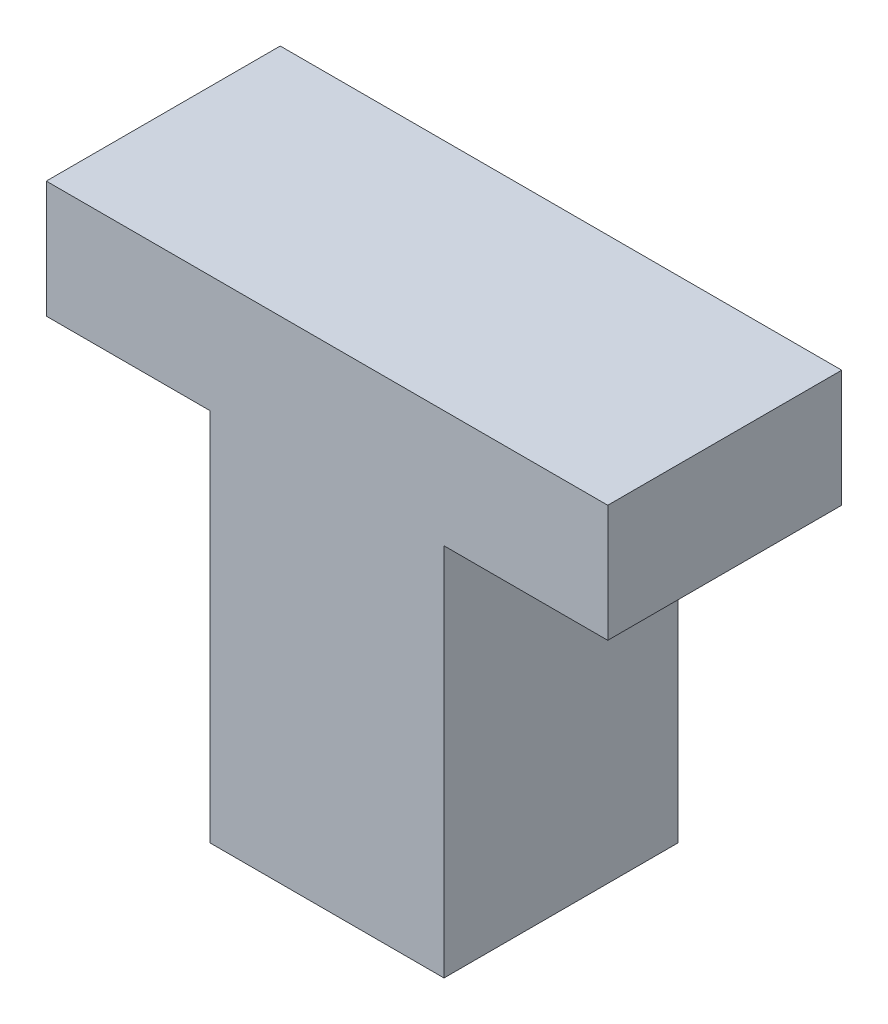
ISO-10303-21;
HEADER;
FILE_DESCRIPTION(('STEP AP214'),'2;1');
FILE_NAME('part.step','',(''),(''),'','','');
FILE_SCHEMA(('AUTOMOTIVE_DESIGN { 1 0 10303 214 1 1 1 1 }'));
ENDSEC;
DATA;
#1=APPLICATION_CONTEXT('core data for automotive mechanical design processes');
#2=APPLICATION_PROTOCOL_DEFINITION('international standard','automotive_design',2000,#1);
#3=PRODUCT_CONTEXT('',#1,'mechanical');
#4=PRODUCT('Part','Part','',(#3));
#5=PRODUCT_RELATED_PRODUCT_CATEGORY('part','',(#4));
#6=PRODUCT_DEFINITION_FORMATION('','',#4);
#7=PRODUCT_DEFINITION_CONTEXT('part definition',#1,'design');
#8=PRODUCT_DEFINITION('design','',#6,#7);
#9=PRODUCT_DEFINITION_SHAPE('','',#8);
#10=(LENGTH_UNIT() NAMED_UNIT(*) SI_UNIT(.MILLI.,.METRE.));
#11=(NAMED_UNIT(*) PLANE_ANGLE_UNIT() SI_UNIT($,.RADIAN.));
#12=(NAMED_UNIT(*) SI_UNIT($,.STERADIAN.) SOLID_ANGLE_UNIT());
#13=UNCERTAINTY_MEASURE_WITH_UNIT(LENGTH_MEASURE(1.E-05),#10,'distance_accuracy_value','');
#14=(GEOMETRIC_REPRESENTATION_CONTEXT(3) GLOBAL_UNCERTAINTY_ASSIGNED_CONTEXT((#13)) GLOBAL_UNIT_ASSIGNED_CONTEXT((#10,
#11,#12)) REPRESENTATION_CONTEXT('',''));
#15=CARTESIAN_POINT('',(0.,0.,0.));
#16=DIRECTION('',(0.,0.,1.));
#17=DIRECTION('',(1.,0.,0.));
#18=AXIS2_PLACEMENT_3D('',#15,#16,#17);
#19=CARTESIAN_POINT('',(-2.5,8.,2.5));
#20=DIRECTION('',(1.,0.,0.));
#21=DIRECTION('',(0.,1.,0.));
#22=AXIS2_PLACEMENT_3D('',#19,#20,#21);
#23=PLANE('',#22);
#24=DIRECTION('',(0.,-1.,0.));
#25=VECTOR('',#24,1.);
#26=CARTESIAN_POINT('',(-2.5,8.,-2.5));
#27=LINE('',#26,#25);
#28=CARTESIAN_POINT('',(-2.5,8.,-2.5));
#29=VERTEX_POINT('',#28);
#30=CARTESIAN_POINT('',(-2.5,0.,-2.5));
#31=VERTEX_POINT('',#30);
#32=EDGE_CURVE('E140',#29,#31,#27,.T.);
#33=ORIENTED_EDGE('',*,*,#32,.T.);
#34=DIRECTION('',(0.,0.,-1.));
#35=VECTOR('',#34,1.);
#36=CARTESIAN_POINT('',(-2.5,0.,2.5));
#37=LINE('',#36,#35);
#38=CARTESIAN_POINT('',(-2.5,0.,2.5));
#39=VERTEX_POINT('',#38);
#40=EDGE_CURVE('E11',#39,#31,#37,.T.);
#41=ORIENTED_EDGE('',*,*,#40,.F.);
#42=DIRECTION('',(0.,-1.,0.));
#43=VECTOR('',#42,1.);
#44=CARTESIAN_POINT('',(-2.5,8.,2.5));
#45=LINE('',#44,#43);
#46=CARTESIAN_POINT('',(-2.5,8.,2.5));
#47=VERTEX_POINT('',#46);
#48=EDGE_CURVE('E162',#47,#39,#45,.T.);
#49=ORIENTED_EDGE('',*,*,#48,.F.);
#50=DIRECTION('',(0.,0.,-1.));
#51=VECTOR('',#50,1.);
#52=CARTESIAN_POINT('',(-2.5,8.,2.5));
#53=LINE('',#52,#51);
#54=EDGE_CURVE('E136',#47,#29,#53,.T.);
#55=ORIENTED_EDGE('',*,*,#54,.T.);
#56=EDGE_LOOP('',(#33,#41,#49,#55));
#57=FACE_BOUND('',#56,.T.);
#58=ADVANCED_FACE('F39',(#57),#23,.F.);
#59=CARTESIAN_POINT('',(-2.5,0.,2.5));
#60=DIRECTION('',(0.,1.,0.));
#61=DIRECTION('',(-1.,0.,0.));
#62=AXIS2_PLACEMENT_3D('',#59,#60,#61);
#63=PLANE('',#62);
#64=DIRECTION('',(1.,0.,0.));
#65=VECTOR('',#64,1.);
#66=CARTESIAN_POINT('',(-2.5,0.,-2.5));
#67=LINE('',#66,#65);
#68=CARTESIAN_POINT('',(2.5,0.,-2.5));
#69=VERTEX_POINT('',#68);
#70=EDGE_CURVE('E144',#31,#69,#67,.T.);
#71=ORIENTED_EDGE('',*,*,#70,.T.);
#72=DIRECTION('',(0.,0.,-1.));
#73=VECTOR('',#72,1.);
#74=CARTESIAN_POINT('',(2.5,0.,2.5));
#75=LINE('',#74,#73);
#76=CARTESIAN_POINT('',(2.5,0.,2.5));
#77=VERTEX_POINT('',#76);
#78=EDGE_CURVE('E48',#77,#69,#75,.T.);
#79=ORIENTED_EDGE('',*,*,#78,.F.);
#80=DIRECTION('',(1.,0.,0.));
#81=VECTOR('',#80,1.);
#82=CARTESIAN_POINT('',(-2.5,0.,2.5));
#83=LINE('',#82,#81);
#84=EDGE_CURVE('E99',#39,#77,#83,.T.);
#85=ORIENTED_EDGE('',*,*,#84,.F.);
#86=ORIENTED_EDGE('',*,*,#40,.T.);
#87=EDGE_LOOP('',(#71,#79,#85,#86));
#88=FACE_BOUND('',#87,.T.);
#89=ADVANCED_FACE('F208',(#88),#63,.F.);
#90=CARTESIAN_POINT('',(2.5,0.,2.5));
#91=DIRECTION('',(-1.,0.,0.));
#92=DIRECTION('',(0.,-1.,0.));
#93=AXIS2_PLACEMENT_3D('',#90,#91,#92);
#94=PLANE('',#93);
#95=DIRECTION('',(0.,1.,0.));
#96=VECTOR('',#95,1.);
#97=CARTESIAN_POINT('',(2.5,0.,-2.5));
#98=LINE('',#97,#96);
#99=CARTESIAN_POINT('',(2.5,8.,-2.5));
#100=VERTEX_POINT('',#99);
#101=EDGE_CURVE('E147',#69,#100,#98,.T.);
#102=ORIENTED_EDGE('',*,*,#101,.T.);
#103=DIRECTION('',(0.,0.,-1.));
#104=VECTOR('',#103,1.);
#105=CARTESIAN_POINT('',(2.5,8.,2.5));
#106=LINE('',#105,#104);
#107=CARTESIAN_POINT('',(2.5,8.,2.5));
#108=VERTEX_POINT('',#107);
#109=EDGE_CURVE('E173',#108,#100,#106,.T.);
#110=ORIENTED_EDGE('',*,*,#109,.F.);
#111=DIRECTION('',(0.,1.,0.));
#112=VECTOR('',#111,1.);
#113=CARTESIAN_POINT('',(2.5,0.,2.5));
#114=LINE('',#113,#112);
#115=EDGE_CURVE('E183',#77,#108,#114,.T.);
#116=ORIENTED_EDGE('',*,*,#115,.F.);
#117=ORIENTED_EDGE('',*,*,#78,.T.);
#118=EDGE_LOOP('',(#102,#110,#116,#117));
#119=FACE_BOUND('',#118,.T.);
#120=ADVANCED_FACE('F181',(#119),#94,.F.);
#121=CARTESIAN_POINT('',(2.5,8.,2.5));
#122=DIRECTION('',(0.,1.,0.));
#123=DIRECTION('',(0.,0.,1.));
#124=AXIS2_PLACEMENT_3D('',#121,#122,#123);
#125=PLANE('',#124);
#126=DIRECTION('',(1.,0.,0.));
#127=VECTOR('',#126,1.);
#128=CARTESIAN_POINT('',(2.5,8.,-2.5));
#129=LINE('',#128,#127);
#130=CARTESIAN_POINT('',(6.,8.,-2.5));
#131=VERTEX_POINT('',#130);
#132=EDGE_CURVE('E150',#100,#131,#129,.T.);
#133=ORIENTED_EDGE('',*,*,#132,.T.);
#134=DIRECTION('',(0.,0.,-1.));
#135=VECTOR('',#134,1.);
#136=CARTESIAN_POINT('',(6.,8.,2.5));
#137=LINE('',#136,#135);
#138=CARTESIAN_POINT('',(6.,8.,2.5));
#139=VERTEX_POINT('',#138);
#140=EDGE_CURVE('E169',#139,#131,#137,.T.);
#141=ORIENTED_EDGE('',*,*,#140,.F.);
#142=DIRECTION('',(1.,0.,0.));
#143=VECTOR('',#142,1.);
#144=CARTESIAN_POINT('',(2.5,8.,2.5));
#145=LINE('',#144,#143);
#146=EDGE_CURVE('E196',#108,#139,#145,.T.);
#147=ORIENTED_EDGE('',*,*,#146,.F.);
#148=ORIENTED_EDGE('',*,*,#109,.T.);
#149=EDGE_LOOP('',(#133,#141,#147,#148));
#150=FACE_BOUND('',#149,.T.);
#151=ADVANCED_FACE('F191',(#150),#125,.F.);
#152=CARTESIAN_POINT('',(6.,8.,2.5));
#153=DIRECTION('',(-1.,0.,0.));
#154=DIRECTION('',(0.,-1.,0.));
#155=AXIS2_PLACEMENT_3D('',#152,#153,#154);
#156=PLANE('',#155);
#157=DIRECTION('',(0.,1.,0.));
#158=VECTOR('',#157,1.);
#159=CARTESIAN_POINT('',(6.,8.,-2.5));
#160=LINE('',#159,#158);
#161=CARTESIAN_POINT('',(6.,10.5,-2.5));
#162=VERTEX_POINT('',#161);
#163=EDGE_CURVE('E153',#131,#162,#160,.T.);
#164=ORIENTED_EDGE('',*,*,#163,.T.);
#165=DIRECTION('',(0.,0.,-1.));
#166=VECTOR('',#165,1.);
#167=CARTESIAN_POINT('',(6.,10.5,2.5));
#168=LINE('',#167,#166);
#169=CARTESIAN_POINT('',(6.,10.5,2.5));
#170=VERTEX_POINT('',#169);
#171=EDGE_CURVE('E129',#170,#162,#168,.T.);
#172=ORIENTED_EDGE('',*,*,#171,.F.);
#173=DIRECTION('',(0.,1.,0.));
#174=VECTOR('',#173,1.);
#175=CARTESIAN_POINT('',(6.,8.,2.5));
#176=LINE('',#175,#174);
#177=EDGE_CURVE('E118',#139,#170,#176,.T.);
#178=ORIENTED_EDGE('',*,*,#177,.F.);
#179=ORIENTED_EDGE('',*,*,#140,.T.);
#180=EDGE_LOOP('',(#164,#172,#178,#179));
#181=FACE_BOUND('',#180,.T.);
#182=ADVANCED_FACE('F194',(#181),#156,.F.);
#183=CARTESIAN_POINT('',(6.,10.5,2.5));
#184=DIRECTION('',(0.,-1.,0.));
#185=DIRECTION('',(0.,0.,-1.));
#186=AXIS2_PLACEMENT_3D('',#183,#184,#185);
#187=PLANE('',#186);
#188=DIRECTION('',(-1.,0.,0.));
#189=VECTOR('',#188,1.);
#190=CARTESIAN_POINT('',(6.,10.5,-2.5));
#191=LINE('',#190,#189);
#192=CARTESIAN_POINT('',(-6.,10.5,-2.5));
#193=VERTEX_POINT('',#192);
#194=EDGE_CURVE('E127',#162,#193,#191,.T.);
#195=ORIENTED_EDGE('',*,*,#194,.T.);
#196=DIRECTION('',(0.,0.,-1.));
#197=VECTOR('',#196,1.);
#198=CARTESIAN_POINT('',(-6.,10.5,2.5));
#199=LINE('',#198,#197);
#200=CARTESIAN_POINT('',(-6.,10.5,2.5));
#201=VERTEX_POINT('',#200);
#202=EDGE_CURVE('E124',#201,#193,#199,.T.);
#203=ORIENTED_EDGE('',*,*,#202,.F.);
#204=DIRECTION('',(-1.,0.,0.));
#205=VECTOR('',#204,1.);
#206=CARTESIAN_POINT('',(6.,10.5,2.5));
#207=LINE('',#206,#205);
#208=EDGE_CURVE('E112',#170,#201,#207,.T.);
#209=ORIENTED_EDGE('',*,*,#208,.F.);
#210=ORIENTED_EDGE('',*,*,#171,.T.);
#211=EDGE_LOOP('',(#195,#203,#209,#210));
#212=FACE_BOUND('',#211,.T.);
#213=ADVANCED_FACE('F125',(#212),#187,.F.);
#214=CARTESIAN_POINT('',(-6.,10.5,2.5));
#215=DIRECTION('',(1.,0.,0.));
#216=DIRECTION('',(0.,0.,-1.));
#217=AXIS2_PLACEMENT_3D('',#214,#215,#216);
#218=PLANE('',#217);
#219=DIRECTION('',(0.,-1.,0.));
#220=VECTOR('',#219,1.);
#221=CARTESIAN_POINT('',(-6.,10.5,-2.5));
#222=LINE('',#221,#220);
#223=CARTESIAN_POINT('',(-6.,8.,-2.5));
#224=VERTEX_POINT('',#223);
#225=EDGE_CURVE('E85',#193,#224,#222,.T.);
#226=ORIENTED_EDGE('',*,*,#225,.T.);
#227=DIRECTION('',(0.,0.,-1.));
#228=VECTOR('',#227,1.);
#229=CARTESIAN_POINT('',(-6.,8.,2.5));
#230=LINE('',#229,#228);
#231=CARTESIAN_POINT('',(-6.,8.,2.5));
#232=VERTEX_POINT('',#231);
#233=EDGE_CURVE('E130',#232,#224,#230,.T.);
#234=ORIENTED_EDGE('',*,*,#233,.F.);
#235=DIRECTION('',(0.,-1.,0.));
#236=VECTOR('',#235,1.);
#237=CARTESIAN_POINT('',(-6.,10.5,2.5));
#238=LINE('',#237,#236);
#239=EDGE_CURVE('E116',#201,#232,#238,.T.);
#240=ORIENTED_EDGE('',*,*,#239,.F.);
#241=ORIENTED_EDGE('',*,*,#202,.T.);
#242=EDGE_LOOP('',(#226,#234,#240,#241));
#243=FACE_BOUND('',#242,.T.);
#244=ADVANCED_FACE('F132',(#243),#218,.F.);
#245=CARTESIAN_POINT('',(-6.,8.,2.5));
#246=DIRECTION('',(0.,1.,0.));
#247=DIRECTION('',(0.,0.,1.));
#248=AXIS2_PLACEMENT_3D('',#245,#246,#247);
#249=PLANE('',#248);
#250=DIRECTION('',(1.,0.,0.));
#251=VECTOR('',#250,1.);
#252=CARTESIAN_POINT('',(-6.,8.,-2.5));
#253=LINE('',#252,#251);
#254=EDGE_CURVE('E91',#224,#29,#253,.T.);
#255=ORIENTED_EDGE('',*,*,#254,.T.);
#256=ORIENTED_EDGE('',*,*,#54,.F.);
#257=DIRECTION('',(1.,0.,0.));
#258=VECTOR('',#257,1.);
#259=CARTESIAN_POINT('',(-6.,8.,2.5));
#260=LINE('',#259,#258);
#261=EDGE_CURVE('E56',#232,#47,#260,.T.);
#262=ORIENTED_EDGE('',*,*,#261,.F.);
#263=ORIENTED_EDGE('',*,*,#233,.T.);
#264=EDGE_LOOP('',(#255,#256,#262,#263));
#265=FACE_BOUND('',#264,.T.);
#266=ADVANCED_FACE('F224',(#265),#249,.F.);
#267=CARTESIAN_POINT('',(0.,0.,2.5));
#268=DIRECTION('',(0.,0.,1.));
#269=DIRECTION('',(1.,0.,0.));
#270=AXIS2_PLACEMENT_3D('',#267,#268,#269);
#271=PLANE('',#270);
#272=ORIENTED_EDGE('',*,*,#48,.T.);
#273=ORIENTED_EDGE('',*,*,#84,.T.);
#274=ORIENTED_EDGE('',*,*,#115,.T.);
#275=ORIENTED_EDGE('',*,*,#146,.T.);
#276=ORIENTED_EDGE('',*,*,#177,.T.);
#277=ORIENTED_EDGE('',*,*,#208,.T.);
#278=ORIENTED_EDGE('',*,*,#239,.T.);
#279=ORIENTED_EDGE('',*,*,#261,.T.);
#280=EDGE_LOOP('',(#272,#273,#274,#275,#276,#277,#278,#279));
#281=FACE_BOUND('',#280,.T.);
#282=ADVANCED_FACE('F114',(#281),#271,.T.);
#283=CARTESIAN_POINT('',(0.,0.,-2.5));
#284=DIRECTION('',(0.,0.,1.));
#285=DIRECTION('',(1.,0.,0.));
#286=AXIS2_PLACEMENT_3D('',#283,#284,#285);
#287=PLANE('',#286);
#288=ORIENTED_EDGE('',*,*,#32,.F.);
#289=ORIENTED_EDGE('',*,*,#254,.F.);
#290=ORIENTED_EDGE('',*,*,#225,.F.);
#291=ORIENTED_EDGE('',*,*,#194,.F.);
#292=ORIENTED_EDGE('',*,*,#163,.F.);
#293=ORIENTED_EDGE('',*,*,#132,.F.);
#294=ORIENTED_EDGE('',*,*,#101,.F.);
#295=ORIENTED_EDGE('',*,*,#70,.F.);
#296=EDGE_LOOP('',(#288,#289,#290,#291,#292,#293,#294,#295));
#297=FACE_BOUND('',#296,.T.);
#298=ADVANCED_FACE('F187',(#297),#287,.F.);
#299=CLOSED_SHELL('',(#58,#89,#120,#151,#182,#213,#244,#266,#282,#298));
#300=MANIFOLD_SOLID_BREP('B2',#299);
#301=ADVANCED_BREP_SHAPE_REPRESENTATION('',(#18,#300),#14);
#302=SHAPE_DEFINITION_REPRESENTATION(#9,#301);
ENDSEC;
END-ISO-10303-21;
